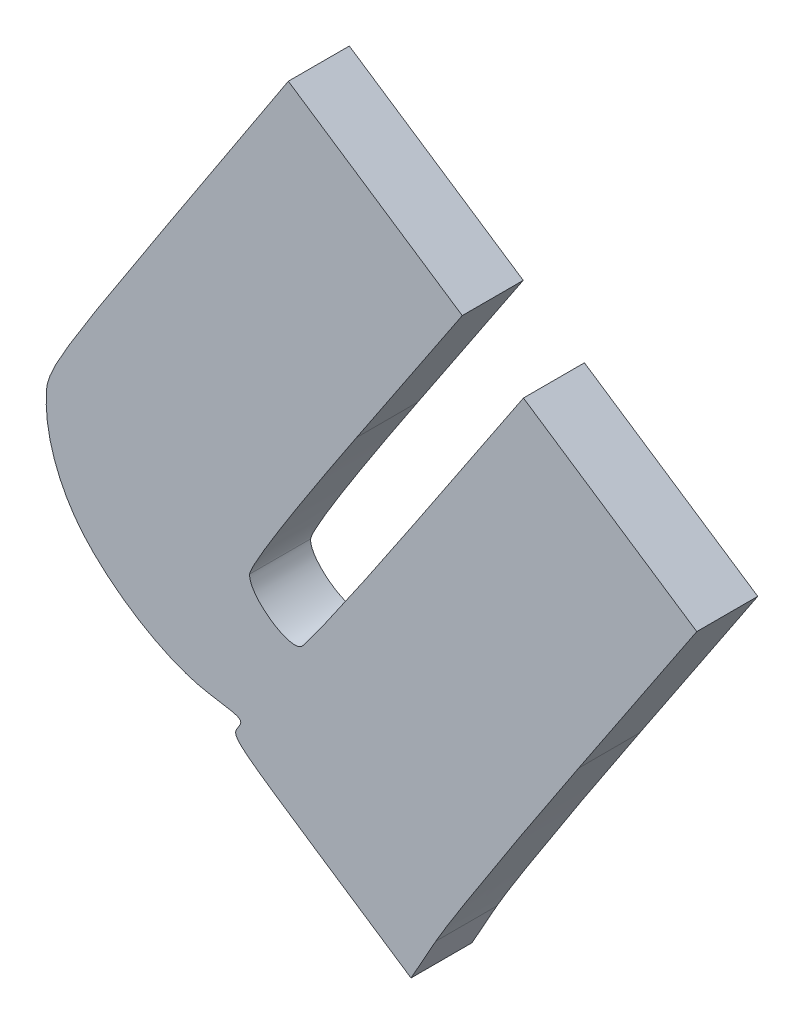
ISO-10303-21;
HEADER;
FILE_DESCRIPTION(('STEP AP214'),'2;1');
FILE_NAME('part.step','',(''),(''),'','','');
FILE_SCHEMA(('AUTOMOTIVE_DESIGN { 1 0 10303 214 1 1 1 1 }'));
ENDSEC;
DATA;
#1=APPLICATION_CONTEXT('core data for automotive mechanical design processes');
#2=APPLICATION_PROTOCOL_DEFINITION('international standard','automotive_design',2000,#1);
#3=PRODUCT_CONTEXT('',#1,'mechanical');
#4=PRODUCT('Part','Part','',(#3));
#5=PRODUCT_RELATED_PRODUCT_CATEGORY('part','',(#4));
#6=PRODUCT_DEFINITION_FORMATION('','',#4);
#7=PRODUCT_DEFINITION_CONTEXT('part definition',#1,'design');
#8=PRODUCT_DEFINITION('design','',#6,#7);
#9=PRODUCT_DEFINITION_SHAPE('','',#8);
#10=(LENGTH_UNIT() NAMED_UNIT(*) SI_UNIT(.MILLI.,.METRE.));
#11=(NAMED_UNIT(*) PLANE_ANGLE_UNIT() SI_UNIT($,.RADIAN.));
#12=(NAMED_UNIT(*) SI_UNIT($,.STERADIAN.) SOLID_ANGLE_UNIT());
#13=UNCERTAINTY_MEASURE_WITH_UNIT(LENGTH_MEASURE(1.E-05),#10,'distance_accuracy_value','');
#14=(GEOMETRIC_REPRESENTATION_CONTEXT(3) GLOBAL_UNCERTAINTY_ASSIGNED_CONTEXT((#13)) GLOBAL_UNIT_ASSIGNED_CONTEXT((#10,
#11,#12)) REPRESENTATION_CONTEXT('',''));
#15=CARTESIAN_POINT('',(0.,0.,0.));
#16=DIRECTION('',(0.,0.,1.));
#17=DIRECTION('',(1.,0.,0.));
#18=AXIS2_PLACEMENT_3D('',#15,#16,#17);
#19=CARTESIAN_POINT('',(-3.332705659981,-2.348591750992,0.));
#20=DIRECTION('',(-0.831947176556522,0.5548548417556,0.));
#21=DIRECTION('',(-0.5548548417556,-0.831947176556522,0.));
#22=AXIS2_PLACEMENT_3D('',#19,#20,#21);
#23=PLANE('',#22);
#24=DIRECTION('',(-0.5548548417556,-0.831947176556522,0.));
#25=VECTOR('',#24,1.);
#26=CARTESIAN_POINT('',(-3.332705659981,-2.348591750992,0.));
#27=LINE('',#26,#25);
#28=CARTESIAN_POINT('',(-3.332705659981,-2.348591750992,0.));
#29=VERTEX_POINT('',#28);
#30=CARTESIAN_POINT('',(-3.350218754394,-2.374850816163,0.));
#31=VERTEX_POINT('',#30);
#32=EDGE_CURVE('E11',#29,#31,#27,.T.);
#33=ORIENTED_EDGE('',*,*,#32,.T.);
#34=DIRECTION('',(0.,0.,1.));
#35=VECTOR('',#34,1.);
#36=CARTESIAN_POINT('',(-3.350218754394,-2.374850816163,0.));
#37=LINE('',#36,#35);
#38=CARTESIAN_POINT('',(-3.350218754394,-2.374850816163,0.01));
#39=VERTEX_POINT('',#38);
#40=EDGE_CURVE('E24',#31,#39,#37,.T.);
#41=ORIENTED_EDGE('',*,*,#40,.T.);
#42=DIRECTION('',(-0.5548548417556,-0.831947176556522,0.));
#43=VECTOR('',#42,1.);
#44=CARTESIAN_POINT('',(-3.332705659981,-2.348591750992,0.01));
#45=LINE('',#44,#43);
#46=CARTESIAN_POINT('',(-3.332705659981,-2.348591750992,0.01));
#47=VERTEX_POINT('',#46);
#48=EDGE_CURVE('E154',#47,#39,#45,.T.);
#49=ORIENTED_EDGE('',*,*,#48,.F.);
#50=DIRECTION('',(0.,0.,1.));
#51=VECTOR('',#50,1.);
#52=CARTESIAN_POINT('',(-3.332705659981,-2.348591750992,0.));
#53=LINE('',#52,#51);
#54=EDGE_CURVE('E349',#29,#47,#53,.T.);
#55=ORIENTED_EDGE('',*,*,#54,.F.);
#56=EDGE_LOOP('',(#33,#41,#49,#55));
#57=FACE_BOUND('',#56,.T.);
#58=ADVANCED_FACE('F17',(#57),#23,.T.);
#59=CARTESIAN_POINT('',(-3.304288751086,-2.367543987302,0.));
#60=DIRECTION('',(0.554854841755568,0.831947176556543,0.));
#61=DIRECTION('',(-0.831947176556543,0.554854841755568,0.));
#62=AXIS2_PLACEMENT_3D('',#59,#60,#61);
#63=PLANE('',#62);
#64=DIRECTION('',(-0.831947176556543,0.554854841755568,0.));
#65=VECTOR('',#64,1.);
#66=CARTESIAN_POINT('',(-3.304288751086,-2.367543987302,0.));
#67=LINE('',#66,#65);
#68=CARTESIAN_POINT('',(-3.304288751086,-2.367543987302,0.));
#69=VERTEX_POINT('',#68);
#70=EDGE_CURVE('E348',#69,#29,#67,.T.);
#71=ORIENTED_EDGE('',*,*,#70,.T.);
#72=ORIENTED_EDGE('',*,*,#54,.T.);
#73=DIRECTION('',(-0.831947176556543,0.554854841755568,0.));
#74=VECTOR('',#73,1.);
#75=CARTESIAN_POINT('',(-3.304288751086,-2.367543987302,0.01));
#76=LINE('',#75,#74);
#77=CARTESIAN_POINT('',(-3.304288751086,-2.367543987302,0.01));
#78=VERTEX_POINT('',#77);
#79=EDGE_CURVE('E353',#78,#47,#76,.T.);
#80=ORIENTED_EDGE('',*,*,#79,.F.);
#81=DIRECTION('',(0.,0.,1.));
#82=VECTOR('',#81,1.);
#83=CARTESIAN_POINT('',(-3.304288751086,-2.367543987302,0.));
#84=LINE('',#83,#82);
#85=EDGE_CURVE('E351',#69,#78,#84,.T.);
#86=ORIENTED_EDGE('',*,*,#85,.F.);
#87=EDGE_LOOP('',(#71,#72,#80,#86));
#88=FACE_BOUND('',#87,.T.);
#89=ADVANCED_FACE('F337',(#88),#63,.T.);
#90=CARTESIAN_POINT('',(-3.323645983482,-2.396596436384,0.));
#91=DIRECTION('',(0.832196577634114,-0.554480708567997,0.));
#92=DIRECTION('',(0.554480708567997,0.832196577634114,0.));
#93=AXIS2_PLACEMENT_3D('',#90,#91,#92);
#94=PLANE('',#93);
#95=DIRECTION('',(0.554480708567997,0.832196577634114,0.));
#96=VECTOR('',#95,1.);
#97=CARTESIAN_POINT('',(-3.323645983482,-2.396596436384,0.));
#98=LINE('',#97,#96);
#99=CARTESIAN_POINT('',(-3.323645983482,-2.396596436384,0.));
#100=VERTEX_POINT('',#99);
#101=EDGE_CURVE('E482',#100,#69,#98,.T.);
#102=ORIENTED_EDGE('',*,*,#101,.T.);
#103=ORIENTED_EDGE('',*,*,#85,.T.);
#104=DIRECTION('',(0.554480708567997,0.832196577634114,0.));
#105=VECTOR('',#104,1.);
#106=CARTESIAN_POINT('',(-3.323645983482,-2.396596436384,0.01));
#107=LINE('',#106,#105);
#108=CARTESIAN_POINT('',(-3.323645983482,-2.396596436384,0.01));
#109=VERTEX_POINT('',#108);
#110=EDGE_CURVE('E479',#109,#78,#107,.T.);
#111=ORIENTED_EDGE('',*,*,#110,.F.);
#112=DIRECTION('',(0.,0.,1.));
#113=VECTOR('',#112,1.);
#114=CARTESIAN_POINT('',(-3.323645983482,-2.396596436384,0.));
#115=LINE('',#114,#113);
#116=EDGE_CURVE('E473',#100,#109,#115,.T.);
#117=ORIENTED_EDGE('',*,*,#116,.F.);
#118=EDGE_LOOP('',(#102,#103,#111,#117));
#119=FACE_BOUND('',#118,.T.);
#120=ADVANCED_FACE('F329',(#119),#94,.T.);
#121=CARTESIAN_POINT('',(-3.347073290902,-2.432896745225,0.));
#122=CARTESIAN_POINT('',(-3.347073290902,-2.432896745225,0.01));
#123=CARTESIAN_POINT('',(-3.345444337573,-2.429988125205,0.));
#124=CARTESIAN_POINT('',(-3.345444337573,-2.429988125205,0.01));
#125=CARTESIAN_POINT('',(-3.339799899815,-2.421229037819,0.));
#126=CARTESIAN_POINT('',(-3.339799899815,-2.421229037819,0.01));
#127=CARTESIAN_POINT('',(-3.333863544286,-2.412029649405,0.));
#128=CARTESIAN_POINT('',(-3.333863544286,-2.412029649405,0.01));
#129=CARTESIAN_POINT('',(-3.328547125337,-2.403945189284,0.));
#130=CARTESIAN_POINT('',(-3.328547125337,-2.403945189284,0.01));
#131=CARTESIAN_POINT('',(-3.323645983482,-2.396596436384,0.));
#132=CARTESIAN_POINT('',(-3.323645983482,-2.396596436384,0.01));
#133=B_SPLINE_SURFACE_WITH_KNOTS('',3,1,((#121,#122),(#123,#124),(#125,#126),(#127,#128),(#129,
#130),(#131,#132)),.UNSPECIFIED.,.F.,.F.,.F.,(4,2,4),(2,2),(0.,0.001461185432297,
0.006761103341243),(0.,0.001),.UNSPECIFIED.);
#134=CARTESIAN_POINT('',(-3.347073290902,-2.432896745225,0.));
#135=CARTESIAN_POINT('',(-3.345444337573,-2.429988125205,0.));
#136=CARTESIAN_POINT('',(-3.339799899815,-2.421229037819,0.));
#137=CARTESIAN_POINT('',(-3.333863544286,-2.412029649405,0.));
#138=CARTESIAN_POINT('',(-3.328547125337,-2.403945189284,0.));
#139=CARTESIAN_POINT('',(-3.323645983482,-2.396596436384,0.));
#140=B_SPLINE_CURVE_WITH_KNOTS('',3,(#134,#135,#136,#137,#138,#139),.UNSPECIFIED.,.F.,.F.,(4,2,
4),(0.,0.001461185432297,0.006761103341243),.UNSPECIFIED.);
#141=CARTESIAN_POINT('',(-3.347073290902,-2.432896745225,0.));
#142=VERTEX_POINT('',#141);
#143=EDGE_CURVE('E465',#142,#100,#140,.T.);
#144=CARTESIAN_POINT('',(-3.347073290902,-2.432896745225,0.01));
#145=CARTESIAN_POINT('',(-3.345444337573,-2.429988125205,0.01));
#146=CARTESIAN_POINT('',(-3.339799899815,-2.421229037819,0.01));
#147=CARTESIAN_POINT('',(-3.333863544286,-2.412029649405,0.01));
#148=CARTESIAN_POINT('',(-3.328547125337,-2.403945189284,0.01));
#149=CARTESIAN_POINT('',(-3.323645983482,-2.396596436384,0.01));
#150=B_SPLINE_CURVE_WITH_KNOTS('',3,(#144,#145,#146,#147,#148,#149),.UNSPECIFIED.,.F.,.F.,(4,2,
4),(0.,0.001461185432297,0.006761103341243),.UNSPECIFIED.);
#151=CARTESIAN_POINT('',(-3.347073290902,-2.432896745225,0.01));
#152=VERTEX_POINT('',#151);
#153=EDGE_CURVE('E460',#152,#109,#150,.T.);
#154=DIRECTION('',(0.,0.,1.));
#155=VECTOR('',#154,1.);
#156=CARTESIAN_POINT('',(-3.347073290902,-2.432896745225,0.));
#157=LINE('',#156,#155);
#158=EDGE_CURVE('E457',#142,#152,#157,.T.);
#159=ORIENTED_EDGE('',*,*,#143,.T.);
#160=ORIENTED_EDGE('',*,*,#116,.T.);
#161=ORIENTED_EDGE('',*,*,#153,.F.);
#162=ORIENTED_EDGE('',*,*,#158,.F.);
#163=EDGE_LOOP('',(#159,#160,#161,#162));
#164=FACE_BOUND('',#163,.T.);
#165=ADVANCED_FACE('F323',(#164),#133,.T.);
#166=CARTESIAN_POINT('',(-3.351135260486,-2.44014999192,0.));
#167=DIRECTION('',(0.872498250070727,-0.488617236314398,0.));
#168=DIRECTION('',(0.488617236314398,0.872498250070727,0.));
#169=AXIS2_PLACEMENT_3D('',#166,#167,#168);
#170=PLANE('',#169);
#171=DIRECTION('',(0.488617236314398,0.872498250070727,0.));
#172=VECTOR('',#171,1.);
#173=CARTESIAN_POINT('',(-3.351135260486,-2.44014999192,0.));
#174=LINE('',#173,#172);
#175=CARTESIAN_POINT('',(-3.351135260486,-2.44014999192,0.));
#176=VERTEX_POINT('',#175);
#177=EDGE_CURVE('E454',#176,#142,#174,.T.);
#178=ORIENTED_EDGE('',*,*,#177,.T.);
#179=ORIENTED_EDGE('',*,*,#158,.T.);
#180=DIRECTION('',(0.488617236314398,0.872498250070727,0.));
#181=VECTOR('',#180,1.);
#182=CARTESIAN_POINT('',(-3.351135260486,-2.44014999192,0.01));
#183=LINE('',#182,#181);
#184=CARTESIAN_POINT('',(-3.351135260486,-2.44014999192,0.01));
#185=VERTEX_POINT('',#184);
#186=EDGE_CURVE('E451',#185,#152,#183,.T.);
#187=ORIENTED_EDGE('',*,*,#186,.F.);
#188=DIRECTION('',(0.,0.,1.));
#189=VECTOR('',#188,1.);
#190=CARTESIAN_POINT('',(-3.351135260486,-2.44014999192,0.));
#191=LINE('',#190,#189);
#192=EDGE_CURVE('E448',#176,#185,#191,.T.);
#193=ORIENTED_EDGE('',*,*,#192,.F.);
#194=EDGE_LOOP('',(#178,#179,#187,#193));
#195=FACE_BOUND('',#194,.T.);
#196=ADVANCED_FACE('F319',(#195),#170,.T.);
#197=CARTESIAN_POINT('',(-3.365885412259,-2.430312596761,0.));
#198=DIRECTION('',(-0.554854841755558,-0.83194717655655,0.));
#199=DIRECTION('',(0.83194717655655,-0.554854841755558,0.));
#200=AXIS2_PLACEMENT_3D('',#197,#198,#199);
#201=PLANE('',#200);
#202=DIRECTION('',(0.83194717655655,-0.554854841755558,0.));
#203=VECTOR('',#202,1.);
#204=CARTESIAN_POINT('',(-3.365885412259,-2.430312596761,0.));
#205=LINE('',#204,#203);
#206=CARTESIAN_POINT('',(-3.365885412259,-2.430312596761,0.));
#207=VERTEX_POINT('',#206);
#208=EDGE_CURVE('E445',#207,#176,#205,.T.);
#209=ORIENTED_EDGE('',*,*,#208,.T.);
#210=ORIENTED_EDGE('',*,*,#192,.T.);
#211=DIRECTION('',(0.83194717655655,-0.554854841755558,0.));
#212=VECTOR('',#211,1.);
#213=CARTESIAN_POINT('',(-3.365885412259,-2.430312596761,0.01));
#214=LINE('',#213,#212);
#215=CARTESIAN_POINT('',(-3.365885412259,-2.430312596761,0.01));
#216=VERTEX_POINT('',#215);
#217=EDGE_CURVE('E442',#216,#185,#214,.T.);
#218=ORIENTED_EDGE('',*,*,#217,.F.);
#219=DIRECTION('',(0.,0.,1.));
#220=VECTOR('',#219,1.);
#221=CARTESIAN_POINT('',(-3.365885412259,-2.430312596761,0.));
#222=LINE('',#221,#220);
#223=EDGE_CURVE('E436',#207,#216,#222,.T.);
#224=ORIENTED_EDGE('',*,*,#223,.F.);
#225=EDGE_LOOP('',(#209,#210,#218,#224));
#226=FACE_BOUND('',#225,.T.);
#227=ADVANCED_FACE('F310',(#226),#201,.T.);
#228=CARTESIAN_POINT('',(-3.379546498456,-2.418841978034,0.));
#229=CARTESIAN_POINT('',(-3.379546498456,-2.418841978034,0.01));
#230=CARTESIAN_POINT('',(-3.379624902086,-2.41895953613,0.));
#231=CARTESIAN_POINT('',(-3.379624902086,-2.41895953613,0.01));
#232=CARTESIAN_POINT('',(-3.379694728321,-2.41907244743,0.));
#233=CARTESIAN_POINT('',(-3.379694728321,-2.41907244743,0.01));
#234=CARTESIAN_POINT('',(-3.379801820828,-2.419290025889,0.));
#235=CARTESIAN_POINT('',(-3.379801820828,-2.419290025889,0.01));
#236=CARTESIAN_POINT('',(-3.379843580061,-2.419400665608,0.));
#237=CARTESIAN_POINT('',(-3.379843580061,-2.419400665608,0.01));
#238=CARTESIAN_POINT('',(-3.379885738625,-2.419640115929,0.));
#239=CARTESIAN_POINT('',(-3.379885738625,-2.419640115929,0.01));
#240=CARTESIAN_POINT('',(-3.379882046125,-2.419760017036,0.));
#241=CARTESIAN_POINT('',(-3.379882046125,-2.419760017036,0.01));
#242=CARTESIAN_POINT('',(-3.379820890905,-2.420030935849,0.));
#243=CARTESIAN_POINT('',(-3.379820890905,-2.420030935849,0.01));
#244=CARTESIAN_POINT('',(-3.379749295582,-2.420191187819,0.));
#245=CARTESIAN_POINT('',(-3.379749295582,-2.420191187819,0.01));
#246=CARTESIAN_POINT('',(-3.379405563823,-2.420708997672,0.));
#247=CARTESIAN_POINT('',(-3.379405563823,-2.420708997672,0.01));
#248=CARTESIAN_POINT('',(-3.379012380642,-2.421113997978,0.));
#249=CARTESIAN_POINT('',(-3.379012380642,-2.421113997978,0.01));
#250=CARTESIAN_POINT('',(-3.376598911792,-2.423140494786,0.));
#251=CARTESIAN_POINT('',(-3.376598911792,-2.423140494786,0.01));
#252=CARTESIAN_POINT('',(-3.372927520129,-2.425615967266,0.));
#253=CARTESIAN_POINT('',(-3.372927520129,-2.425615967266,0.01));
#254=CARTESIAN_POINT('',(-3.365885412259,-2.430312596761,0.));
#255=CARTESIAN_POINT('',(-3.365885412259,-2.430312596761,0.01));
#256=B_SPLINE_SURFACE_WITH_KNOTS('',3,1,((#228,#229),(#230,#231),(#232,#233),(#234,#235),(#236,
#237),(#238,#239),(#240,#241),(#242,#243),(#244,#245),(#246,#247),(#248,#249),(#250,#251),(#252,
#253),(#254,#255)),.UNSPECIFIED.,.F.,.F.,.F.,(4,2,2,2,2,2,4),(2,2),(0.,0.000768967608709977,
0.001493896604088,0.002259465008467,0.003201944413574,0.004987032742808,0.010065798367626),(0.,
0.001),.UNSPECIFIED.);
#257=CARTESIAN_POINT('',(-3.379546498456,-2.418841978034,0.));
#258=CARTESIAN_POINT('',(-3.379624902086,-2.41895953613,0.));
#259=CARTESIAN_POINT('',(-3.379694728321,-2.41907244743,0.));
#260=CARTESIAN_POINT('',(-3.379801820828,-2.419290025889,0.));
#261=CARTESIAN_POINT('',(-3.379843580061,-2.419400665608,0.));
#262=CARTESIAN_POINT('',(-3.379885738625,-2.419640115929,0.));
#263=CARTESIAN_POINT('',(-3.379882046125,-2.419760017036,0.));
#264=CARTESIAN_POINT('',(-3.379820890905,-2.420030935849,0.));
#265=CARTESIAN_POINT('',(-3.379749295582,-2.420191187819,0.));
#266=CARTESIAN_POINT('',(-3.379405563823,-2.420708997672,0.));
#267=CARTESIAN_POINT('',(-3.379012380642,-2.421113997978,0.));
#268=CARTESIAN_POINT('',(-3.376598911792,-2.423140494786,0.));
#269=CARTESIAN_POINT('',(-3.372927520129,-2.425615967266,0.));
#270=CARTESIAN_POINT('',(-3.365885412259,-2.430312596761,0.));
#271=B_SPLINE_CURVE_WITH_KNOTS('',3,(#257,#258,#259,#260,#261,#262,#263,#264,#265,#266,#267,
#268,#269,#270),.UNSPECIFIED.,.F.,.F.,(4,2,2,2,2,2,4),(0.,0.000768967608709977,
0.001493896604088,0.002259465008467,0.003201944413574,0.004987032742808,0.010065798367626),.UNSPECIFIED.);
#272=CARTESIAN_POINT('',(-3.379546498456,-2.418841978034,0.));
#273=VERTEX_POINT('',#272);
#274=EDGE_CURVE('E428',#273,#207,#271,.T.);
#275=CARTESIAN_POINT('',(-3.379546498456,-2.418841978034,0.01));
#276=CARTESIAN_POINT('',(-3.379624902086,-2.41895953613,0.01));
#277=CARTESIAN_POINT('',(-3.379694728321,-2.41907244743,0.01));
#278=CARTESIAN_POINT('',(-3.379801820828,-2.419290025889,0.01));
#279=CARTESIAN_POINT('',(-3.379843580061,-2.419400665608,0.01));
#280=CARTESIAN_POINT('',(-3.379885738625,-2.419640115929,0.01));
#281=CARTESIAN_POINT('',(-3.379882046125,-2.419760017036,0.01));
#282=CARTESIAN_POINT('',(-3.379820890905,-2.420030935849,0.01));
#283=CARTESIAN_POINT('',(-3.379749295582,-2.420191187819,0.01));
#284=CARTESIAN_POINT('',(-3.379405563823,-2.420708997672,0.01));
#285=CARTESIAN_POINT('',(-3.379012380642,-2.421113997978,0.01));
#286=CARTESIAN_POINT('',(-3.376598911792,-2.423140494786,0.01));
#287=CARTESIAN_POINT('',(-3.372927520129,-2.425615967266,0.01));
#288=CARTESIAN_POINT('',(-3.365885412259,-2.430312596761,0.01));
#289=B_SPLINE_CURVE_WITH_KNOTS('',3,(#275,#276,#277,#278,#279,#280,#281,#282,#283,#284,#285,
#286,#287,#288),.UNSPECIFIED.,.F.,.F.,(4,2,2,2,2,2,4),(0.,0.000768967608709977,
0.001493896604088,0.002259465008467,0.003201944413574,0.004987032742808,0.010065798367626),.UNSPECIFIED.);
#290=CARTESIAN_POINT('',(-3.379546498456,-2.418841978034,0.01));
#291=VERTEX_POINT('',#290);
#292=EDGE_CURVE('E423',#291,#216,#289,.T.);
#293=DIRECTION('',(0.,0.,1.));
#294=VECTOR('',#293,1.);
#295=CARTESIAN_POINT('',(-3.379546498456,-2.418841978034,0.));
#296=LINE('',#295,#294);
#297=EDGE_CURVE('E417',#273,#291,#296,.T.);
#298=ORIENTED_EDGE('',*,*,#274,.T.);
#299=ORIENTED_EDGE('',*,*,#223,.T.);
#300=ORIENTED_EDGE('',*,*,#292,.F.);
#301=ORIENTED_EDGE('',*,*,#297,.F.);
#302=EDGE_LOOP('',(#298,#299,#300,#301));
#303=FACE_BOUND('',#302,.T.);
#304=ADVANCED_FACE('F299',(#303),#256,.T.);
#305=CARTESIAN_POINT('',(-3.38420767803,-2.416325276533,0.));
#306=CARTESIAN_POINT('',(-3.38420767803,-2.416325276533,0.01));
#307=CARTESIAN_POINT('',(-3.3828762608,-2.416529857808,0.));
#308=CARTESIAN_POINT('',(-3.3828762608,-2.416529857808,0.01));
#309=CARTESIAN_POINT('',(-3.3816793414,-2.416717371918,0.));
#310=CARTESIAN_POINT('',(-3.3816793414,-2.416717371918,0.01));
#311=CARTESIAN_POINT('',(-3.380279176911,-2.417003023203,0.));
#312=CARTESIAN_POINT('',(-3.380279176911,-2.417003023203,0.01));
#313=CARTESIAN_POINT('',(-3.379860346039,-2.41711537522,0.));
#314=CARTESIAN_POINT('',(-3.379860346039,-2.41711537522,0.01));
#315=CARTESIAN_POINT('',(-3.379433890341,-2.417297164595,0.));
#316=CARTESIAN_POINT('',(-3.379433890341,-2.417297164595,0.01));
#317=CARTESIAN_POINT('',(-3.379325575501,-2.41735859457,0.));
#318=CARTESIAN_POINT('',(-3.379325575501,-2.41735859457,0.01));
#319=CARTESIAN_POINT('',(-3.379192959382,-2.417466090865,0.));
#320=CARTESIAN_POINT('',(-3.379192959382,-2.417466090865,0.01));
#321=CARTESIAN_POINT('',(-3.379146717426,-2.417513826588,0.));
#322=CARTESIAN_POINT('',(-3.379146717426,-2.417513826588,0.01));
#323=CARTESIAN_POINT('',(-3.379081891921,-2.417618185083,0.));
#324=CARTESIAN_POINT('',(-3.379081891921,-2.417618185083,0.01));
#325=CARTESIAN_POINT('',(-3.379062119028,-2.417670258863,0.));
#326=CARTESIAN_POINT('',(-3.379062119028,-2.417670258863,0.01));
#327=CARTESIAN_POINT('',(-3.379041906829,-2.417795785466,0.));
#328=CARTESIAN_POINT('',(-3.379041906829,-2.417795785466,0.01));
#329=CARTESIAN_POINT('',(-3.379047646557,-2.417865872299,0.));
#330=CARTESIAN_POINT('',(-3.379047646557,-2.417865872299,0.01));
#331=CARTESIAN_POINT('',(-3.379114351654,-2.418172159397,0.));
#332=CARTESIAN_POINT('',(-3.379114351654,-2.418172159397,0.01));
#333=CARTESIAN_POINT('',(-3.379294774169,-2.418464543624,0.));
#334=CARTESIAN_POINT('',(-3.379294774169,-2.418464543624,0.01));
#335=CARTESIAN_POINT('',(-3.379546498456,-2.418841978034,0.));
#336=CARTESIAN_POINT('',(-3.379546498456,-2.418841978034,0.01));
#337=B_SPLINE_SURFACE_WITH_KNOTS('',3,1,((#305,#306),(#307,#308),(#309,#310),(#311,#312),(#313,
#314),(#315,#316),(#317,#318),(#319,#320),(#321,#322),(#323,#324),(#325,#326),(#327,#328),(#329,
#330),(#331,#332),(#333,#334),(#335,#336)),.UNSPECIFIED.,.F.,.F.,.F.,(4,2,2,2,2,2,2,4),(2,2),
(0.,0.00034413270238388,0.000588097697252863,0.000705602347069612,0.000778646167997065,
0.000842349803803281,0.000920098183708306,0.001192303742564),(0.,0.001),.UNSPECIFIED.);
#338=CARTESIAN_POINT('',(-3.38420767803,-2.416325276533,0.));
#339=CARTESIAN_POINT('',(-3.3828762608,-2.416529857808,0.));
#340=CARTESIAN_POINT('',(-3.3816793414,-2.416717371918,0.));
#341=CARTESIAN_POINT('',(-3.380279176911,-2.417003023203,0.));
#342=CARTESIAN_POINT('',(-3.379860346039,-2.41711537522,0.));
#343=CARTESIAN_POINT('',(-3.379433890341,-2.417297164595,0.));
#344=CARTESIAN_POINT('',(-3.379325575501,-2.41735859457,0.));
#345=CARTESIAN_POINT('',(-3.379192959382,-2.417466090865,0.));
#346=CARTESIAN_POINT('',(-3.379146717426,-2.417513826588,0.));
#347=CARTESIAN_POINT('',(-3.379081891921,-2.417618185083,0.));
#348=CARTESIAN_POINT('',(-3.379062119028,-2.417670258863,0.));
#349=CARTESIAN_POINT('',(-3.379041906829,-2.417795785466,0.));
#350=CARTESIAN_POINT('',(-3.379047646557,-2.417865872299,0.));
#351=CARTESIAN_POINT('',(-3.379114351654,-2.418172159397,0.));
#352=CARTESIAN_POINT('',(-3.379294774169,-2.418464543624,0.));
#353=CARTESIAN_POINT('',(-3.379546498456,-2.418841978034,0.));
#354=B_SPLINE_CURVE_WITH_KNOTS('',3,(#338,#339,#340,#341,#342,#343,#344,#345,#346,#347,#348,
#349,#350,#351,#352,#353),.UNSPECIFIED.,.F.,.F.,(4,2,2,2,2,2,2,4),(0.,0.00034413270238388,
0.000588097697252863,0.000705602347069612,0.000778646167997065,0.000842349803803281,
0.000920098183708306,0.001192303742564),.UNSPECIFIED.);
#355=CARTESIAN_POINT('',(-3.38420767803,-2.416325276533,0.));
#356=VERTEX_POINT('',#355);
#357=EDGE_CURVE('E409',#356,#273,#354,.T.);
#358=CARTESIAN_POINT('',(-3.38420767803,-2.416325276533,0.01));
#359=CARTESIAN_POINT('',(-3.3828762608,-2.416529857808,0.01));
#360=CARTESIAN_POINT('',(-3.3816793414,-2.416717371918,0.01));
#361=CARTESIAN_POINT('',(-3.380279176911,-2.417003023203,0.01));
#362=CARTESIAN_POINT('',(-3.379860346039,-2.41711537522,0.01));
#363=CARTESIAN_POINT('',(-3.379433890341,-2.417297164595,0.01));
#364=CARTESIAN_POINT('',(-3.379325575501,-2.41735859457,0.01));
#365=CARTESIAN_POINT('',(-3.379192959382,-2.417466090865,0.01));
#366=CARTESIAN_POINT('',(-3.379146717426,-2.417513826588,0.01));
#367=CARTESIAN_POINT('',(-3.379081891921,-2.417618185083,0.01));
#368=CARTESIAN_POINT('',(-3.379062119028,-2.417670258863,0.01));
#369=CARTESIAN_POINT('',(-3.379041906829,-2.417795785466,0.01));
#370=CARTESIAN_POINT('',(-3.379047646557,-2.417865872299,0.01));
#371=CARTESIAN_POINT('',(-3.379114351654,-2.418172159397,0.01));
#372=CARTESIAN_POINT('',(-3.379294774169,-2.418464543624,0.01));
#373=CARTESIAN_POINT('',(-3.379546498456,-2.418841978034,0.01));
#374=B_SPLINE_CURVE_WITH_KNOTS('',3,(#358,#359,#360,#361,#362,#363,#364,#365,#366,#367,#368,
#369,#370,#371,#372,#373),.UNSPECIFIED.,.F.,.F.,(4,2,2,2,2,2,2,4),(0.,0.00034413270238388,
0.000588097697252863,0.000705602347069612,0.000778646167997065,0.000842349803803281,
0.000920098183708306,0.001192303742564),.UNSPECIFIED.);
#375=CARTESIAN_POINT('',(-3.38420767803,-2.416325276533,0.01));
#376=VERTEX_POINT('',#375);
#377=EDGE_CURVE('E404',#376,#291,#374,.T.);
#378=DIRECTION('',(0.,0.,1.));
#379=VECTOR('',#378,1.);
#380=CARTESIAN_POINT('',(-3.38420767803,-2.416325276533,0.));
#381=LINE('',#380,#379);
#382=EDGE_CURVE('E401',#356,#376,#381,.T.);
#383=ORIENTED_EDGE('',*,*,#357,.T.);
#384=ORIENTED_EDGE('',*,*,#297,.T.);
#385=ORIENTED_EDGE('',*,*,#377,.F.);
#386=ORIENTED_EDGE('',*,*,#382,.F.);
#387=EDGE_LOOP('',(#383,#384,#385,#386));
#388=FACE_BOUND('',#387,.T.);
#389=ADVANCED_FACE('F284',(#388),#337,.T.);
#390=CARTESIAN_POINT('',(-3.406322203296,-2.402124890551,0.));
#391=CARTESIAN_POINT('',(-3.406322203296,-2.402124890551,0.01));
#392=CARTESIAN_POINT('',(-3.404711758181,-2.404427493198,0.));
#393=CARTESIAN_POINT('',(-3.404711758181,-2.404427493198,0.01));
#394=CARTESIAN_POINT('',(-3.402432255578,-2.406716493274,0.));
#395=CARTESIAN_POINT('',(-3.402432255578,-2.406716493274,0.01));
#396=CARTESIAN_POINT('',(-3.397269351672,-2.410788869601,0.));
#397=CARTESIAN_POINT('',(-3.397269351672,-2.410788869601,0.01));
#398=CARTESIAN_POINT('',(-3.394352740169,-2.412613908735,0.));
#399=CARTESIAN_POINT('',(-3.394352740169,-2.412613908735,0.01));
#400=CARTESIAN_POINT('',(-3.388910693272,-2.415158756643,0.));
#401=CARTESIAN_POINT('',(-3.388910693272,-2.415158756643,0.01));
#402=CARTESIAN_POINT('',(-3.386438290455,-2.415982529726,0.));
#403=CARTESIAN_POINT('',(-3.386438290455,-2.415982529726,0.01));
#404=CARTESIAN_POINT('',(-3.38420767803,-2.416325276533,0.));
#405=CARTESIAN_POINT('',(-3.38420767803,-2.416325276533,0.01));
#406=B_SPLINE_SURFACE_WITH_KNOTS('',3,1,((#390,#391),(#392,#393),(#394,#395),(#396,#397),(#398,
#399),(#400,#401),(#402,#403),(#404,#405)),.UNSPECIFIED.,.F.,.F.,.F.,(4,2,2,4),(2,2),(0.,
0.001623401155154,0.00322098322242,0.004575058028067),(0.,0.001),.UNSPECIFIED.);
#407=CARTESIAN_POINT('',(-3.406322203296,-2.402124890551,0.));
#408=CARTESIAN_POINT('',(-3.404711758181,-2.404427493198,0.));
#409=CARTESIAN_POINT('',(-3.402432255578,-2.406716493274,0.));
#410=CARTESIAN_POINT('',(-3.397269351672,-2.410788869601,0.));
#411=CARTESIAN_POINT('',(-3.394352740169,-2.412613908735,0.));
#412=CARTESIAN_POINT('',(-3.388910693272,-2.415158756643,0.));
#413=CARTESIAN_POINT('',(-3.386438290455,-2.415982529726,0.));
#414=CARTESIAN_POINT('',(-3.38420767803,-2.416325276533,0.));
#415=B_SPLINE_CURVE_WITH_KNOTS('',3,(#407,#408,#409,#410,#411,#412,#413,#414),.UNSPECIFIED.,.F.,
.F.,(4,2,2,4),(0.,0.001623401155154,0.00322098322242,0.004575058028067),.UNSPECIFIED.);
#416=CARTESIAN_POINT('',(-3.406330526529,-2.402120113083,0.));
#417=VERTEX_POINT('',#416);
#418=EDGE_CURVE('E392',#417,#356,#415,.T.);
#419=CARTESIAN_POINT('',(-3.406322203296,-2.402124890551,0.01));
#420=CARTESIAN_POINT('',(-3.404711758181,-2.404427493198,0.01));
#421=CARTESIAN_POINT('',(-3.402432255578,-2.406716493274,0.01));
#422=CARTESIAN_POINT('',(-3.397269351672,-2.410788869601,0.01));
#423=CARTESIAN_POINT('',(-3.394352740169,-2.412613908735,0.01));
#424=CARTESIAN_POINT('',(-3.388910693272,-2.415158756643,0.01));
#425=CARTESIAN_POINT('',(-3.386438290455,-2.415982529726,0.01));
#426=CARTESIAN_POINT('',(-3.38420767803,-2.416325276533,0.01));
#427=B_SPLINE_CURVE_WITH_KNOTS('',3,(#419,#420,#421,#422,#423,#424,#425,#426),.UNSPECIFIED.,.F.,
.F.,(4,2,2,4),(0.,0.001623401155154,0.00322098322242,0.004575058028067),.UNSPECIFIED.);
#428=CARTESIAN_POINT('',(-3.406330526529,-2.402120113083,0.01));
#429=VERTEX_POINT('',#428);
#430=EDGE_CURVE('E380',#429,#376,#427,.T.);
#431=CARTESIAN_POINT('',(-3.406330526529,-2.402120113083,0.));
#432=CARTESIAN_POINT('',(-3.406330526529,-2.402120113083,0.01));
#433=B_SPLINE_CURVE_WITH_KNOTS('',1,(#431,#432),.UNSPECIFIED.,.F.,.F.,(2,2),(0.,0.001),.UNSPECIFIED.);
#434=EDGE_CURVE('E264',#417,#429,#433,.T.);
#435=ORIENTED_EDGE('',*,*,#418,.T.);
#436=ORIENTED_EDGE('',*,*,#382,.T.);
#437=ORIENTED_EDGE('',*,*,#430,.F.);
#438=ORIENTED_EDGE('',*,*,#434,.F.);
#439=EDGE_LOOP('',(#435,#436,#437,#438));
#440=FACE_BOUND('',#439,.T.);
#441=ADVANCED_FACE('F271',(#440),#406,.T.);
#442=CARTESIAN_POINT('',(-3.410874276911,-2.386421847419,0.));
#443=CARTESIAN_POINT('',(-3.410874276911,-2.386421847419,0.01));
#444=CARTESIAN_POINT('',(-3.411097455526,-2.389117585289,0.));
#445=CARTESIAN_POINT('',(-3.411097455526,-2.389117585289,0.01));
#446=CARTESIAN_POINT('',(-3.410773009769,-2.39184893435,0.));
#447=CARTESIAN_POINT('',(-3.410773009769,-2.39184893435,0.01));
#448=CARTESIAN_POINT('',(-3.409228525708,-2.397184998363,0.));
#449=CARTESIAN_POINT('',(-3.409228525708,-2.397184998363,0.01));
#450=CARTESIAN_POINT('',(-3.407964110101,-2.399784392112,0.));
#451=CARTESIAN_POINT('',(-3.407964110101,-2.399784392112,0.01));
#452=CARTESIAN_POINT('',(-3.406330526529,-2.402120113083,0.));
#453=CARTESIAN_POINT('',(-3.406330526529,-2.402120113083,0.01));
#454=B_SPLINE_SURFACE_WITH_KNOTS('',3,1,((#442,#443),(#444,#445),(#446,#447),(#448,#449),(#450,
#451),(#452,#453)),.UNSPECIFIED.,.F.,.F.,.F.,(4,2,4),(2,2),(0.,0.001629590262197,
0.003339767909847),(0.,0.001),.UNSPECIFIED.);
#455=CARTESIAN_POINT('',(-3.410874276911,-2.386421847419,0.));
#456=CARTESIAN_POINT('',(-3.411097455526,-2.389117585289,0.));
#457=CARTESIAN_POINT('',(-3.410773009769,-2.39184893435,0.));
#458=CARTESIAN_POINT('',(-3.409228525708,-2.397184998363,0.));
#459=CARTESIAN_POINT('',(-3.407964110101,-2.399784392112,0.));
#460=CARTESIAN_POINT('',(-3.406330526529,-2.402120113083,0.));
#461=B_SPLINE_CURVE_WITH_KNOTS('',3,(#455,#456,#457,#458,#459,#460),.UNSPECIFIED.,.F.,.F.,(4,2,
4),(0.,0.001629590262197,0.003339767909847),.UNSPECIFIED.);
#462=CARTESIAN_POINT('',(-3.410874276911,-2.386421847419,0.));
#463=VERTEX_POINT('',#462);
#464=EDGE_CURVE('E254',#463,#417,#461,.T.);
#465=CARTESIAN_POINT('',(-3.410874276911,-2.386421847419,0.01));
#466=CARTESIAN_POINT('',(-3.411097455526,-2.389117585289,0.01));
#467=CARTESIAN_POINT('',(-3.410773009769,-2.39184893435,0.01));
#468=CARTESIAN_POINT('',(-3.409228525708,-2.397184998363,0.01));
#469=CARTESIAN_POINT('',(-3.407964110101,-2.399784392112,0.01));
#470=CARTESIAN_POINT('',(-3.406330526529,-2.402120113083,0.01));
#471=B_SPLINE_CURVE_WITH_KNOTS('',3,(#465,#466,#467,#468,#469,#470),.UNSPECIFIED.,.F.,.F.,(4,2,
4),(0.,0.001629590262197,0.003339767909847),.UNSPECIFIED.);
#472=CARTESIAN_POINT('',(-3.410874276911,-2.386421847419,0.01));
#473=VERTEX_POINT('',#472);
#474=EDGE_CURVE('E244',#473,#429,#471,.T.);
#475=DIRECTION('',(0.,0.,1.));
#476=VECTOR('',#475,1.);
#477=CARTESIAN_POINT('',(-3.410874276911,-2.386421847419,0.));
#478=LINE('',#477,#476);
#479=EDGE_CURVE('E238',#463,#473,#478,.T.);
#480=ORIENTED_EDGE('',*,*,#464,.T.);
#481=ORIENTED_EDGE('',*,*,#434,.T.);
#482=ORIENTED_EDGE('',*,*,#474,.F.);
#483=ORIENTED_EDGE('',*,*,#479,.F.);
#484=EDGE_LOOP('',(#480,#481,#482,#483));
#485=FACE_BOUND('',#484,.T.);
#486=ADVANCED_FACE('F283',(#485),#454,.T.);
#487=CARTESIAN_POINT('',(-3.390919504913,-2.352937685292,0.));
#488=CARTESIAN_POINT('',(-3.390919504913,-2.352937685292,0.01));
#489=CARTESIAN_POINT('',(-3.40357441214,-2.372271017224,0.));
#490=CARTESIAN_POINT('',(-3.40357441214,-2.372271017224,0.01));
#491=CARTESIAN_POINT('',(-3.408293687956,-2.379696232637,0.));
#492=CARTESIAN_POINT('',(-3.408293687956,-2.379696232637,0.01));
#493=CARTESIAN_POINT('',(-3.410586442472,-2.384778502708,0.));
#494=CARTESIAN_POINT('',(-3.410586442472,-2.384778502708,0.01));
#495=CARTESIAN_POINT('',(-3.410810171237,-2.385647590028,0.));
#496=CARTESIAN_POINT('',(-3.410810171237,-2.385647590028,0.01));
#497=CARTESIAN_POINT('',(-3.410874276911,-2.386421847419,0.));
#498=CARTESIAN_POINT('',(-3.410874276911,-2.386421847419,0.01));
#499=B_SPLINE_SURFACE_WITH_KNOTS('',3,1,((#487,#488),(#489,#490),(#491,#492),(#493,#494),(#495,
#496),(#497,#498)),.UNSPECIFIED.,.F.,.F.,.F.,(4,2,4),(2,2),(0.,0.001329577323115,
0.001795721352547),(0.,0.001),.UNSPECIFIED.);
#500=CARTESIAN_POINT('',(-3.390919504913,-2.352937685292,0.));
#501=CARTESIAN_POINT('',(-3.40357441214,-2.372271017224,0.));
#502=CARTESIAN_POINT('',(-3.408293687956,-2.379696232637,0.));
#503=CARTESIAN_POINT('',(-3.410586442472,-2.384778502708,0.));
#504=CARTESIAN_POINT('',(-3.410810171237,-2.385647590028,0.));
#505=CARTESIAN_POINT('',(-3.410874276911,-2.386421847419,0.));
#506=B_SPLINE_CURVE_WITH_KNOTS('',3,(#500,#501,#502,#503,#504,#505),.UNSPECIFIED.,.F.,.F.,(4,2,
4),(0.,0.001329577323115,0.001795721352547),.UNSPECIFIED.);
#507=CARTESIAN_POINT('',(-3.390919504913,-2.352937685292,0.));
#508=VERTEX_POINT('',#507);
#509=EDGE_CURVE('E230',#508,#463,#506,.T.);
#510=CARTESIAN_POINT('',(-3.390919504913,-2.352937685292,0.01));
#511=CARTESIAN_POINT('',(-3.40357441214,-2.372271017224,0.01));
#512=CARTESIAN_POINT('',(-3.408293687956,-2.379696232637,0.01));
#513=CARTESIAN_POINT('',(-3.410586442472,-2.384778502708,0.01));
#514=CARTESIAN_POINT('',(-3.410810171237,-2.385647590028,0.01));
#515=CARTESIAN_POINT('',(-3.410874276911,-2.386421847419,0.01));
#516=B_SPLINE_CURVE_WITH_KNOTS('',3,(#510,#511,#512,#513,#514,#515),.UNSPECIFIED.,.F.,.F.,(4,2,
4),(0.,0.001329577323115,0.001795721352547),.UNSPECIFIED.);
#517=CARTESIAN_POINT('',(-3.390919504913,-2.352937685292,0.01));
#518=VERTEX_POINT('',#517);
#519=EDGE_CURVE('E225',#518,#473,#516,.T.);
#520=DIRECTION('',(0.,0.,1.));
#521=VECTOR('',#520,1.);
#522=CARTESIAN_POINT('',(-3.390919504913,-2.352937685292,0.));
#523=LINE('',#522,#521);
#524=EDGE_CURVE('E222',#508,#518,#523,.T.);
#525=ORIENTED_EDGE('',*,*,#509,.T.);
#526=ORIENTED_EDGE('',*,*,#479,.T.);
#527=ORIENTED_EDGE('',*,*,#519,.F.);
#528=ORIENTED_EDGE('',*,*,#524,.F.);
#529=EDGE_LOOP('',(#525,#526,#527,#528));
#530=FACE_BOUND('',#529,.T.);
#531=ADVANCED_FACE('F374',(#530),#499,.T.);
#532=CARTESIAN_POINT('',(-3.371248573924,-2.322886125659,0.));
#533=DIRECTION('',(-0.836691065099124,0.547675142382136,0.));
#534=DIRECTION('',(-0.547675142382136,-0.836691065099124,0.));
#535=AXIS2_PLACEMENT_3D('',#532,#533,#534);
#536=PLANE('',#535);
#537=DIRECTION('',(-0.547675142382136,-0.836691065099124,0.));
#538=VECTOR('',#537,1.);
#539=CARTESIAN_POINT('',(-3.371248573924,-2.322886125659,0.));
#540=LINE('',#539,#538);
#541=CARTESIAN_POINT('',(-3.371248573924,-2.322886125659,0.));
#542=VERTEX_POINT('',#541);
#543=EDGE_CURVE('E219',#542,#508,#540,.T.);
#544=ORIENTED_EDGE('',*,*,#543,.T.);
#545=ORIENTED_EDGE('',*,*,#524,.T.);
#546=DIRECTION('',(-0.547675142382136,-0.836691065099124,0.));
#547=VECTOR('',#546,1.);
#548=CARTESIAN_POINT('',(-3.371248573924,-2.322886125659,0.01));
#549=LINE('',#548,#547);
#550=CARTESIAN_POINT('',(-3.371248573924,-2.322886125659,0.01));
#551=VERTEX_POINT('',#550);
#552=EDGE_CURVE('E216',#551,#518,#549,.T.);
#553=ORIENTED_EDGE('',*,*,#552,.F.);
#554=DIRECTION('',(0.,0.,1.));
#555=VECTOR('',#554,1.);
#556=CARTESIAN_POINT('',(-3.371248573924,-2.322886125659,0.));
#557=LINE('',#556,#555);
#558=EDGE_CURVE('E213',#542,#551,#557,.T.);
#559=ORIENTED_EDGE('',*,*,#558,.F.);
#560=EDGE_LOOP('',(#544,#545,#553,#559));
#561=FACE_BOUND('',#560,.T.);
#562=ADVANCED_FACE('F370',(#561),#536,.T.);
#563=CARTESIAN_POINT('',(-3.342735157237,-2.341902726412,0.));
#564=DIRECTION('',(0.554854841755605,0.831947176556518,0.));
#565=DIRECTION('',(-0.831947176556518,0.554854841755605,0.));
#566=AXIS2_PLACEMENT_3D('',#563,#564,#565);
#567=PLANE('',#566);
#568=DIRECTION('',(-0.831947176556518,0.554854841755605,0.));
#569=VECTOR('',#568,1.);
#570=CARTESIAN_POINT('',(-3.342735157237,-2.341902726412,0.));
#571=LINE('',#570,#569);
#572=CARTESIAN_POINT('',(-3.342735157237,-2.341902726412,0.));
#573=VERTEX_POINT('',#572);
#574=EDGE_CURVE('E210',#573,#542,#571,.T.);
#575=ORIENTED_EDGE('',*,*,#574,.T.);
#576=ORIENTED_EDGE('',*,*,#558,.T.);
#577=DIRECTION('',(-0.831947176556518,0.554854841755605,0.));
#578=VECTOR('',#577,1.);
#579=CARTESIAN_POINT('',(-3.342735157237,-2.341902726412,0.01));
#580=LINE('',#579,#578);
#581=CARTESIAN_POINT('',(-3.342735157237,-2.341902726412,0.01));
#582=VERTEX_POINT('',#581);
#583=EDGE_CURVE('E207',#582,#551,#580,.T.);
#584=ORIENTED_EDGE('',*,*,#583,.F.);
#585=DIRECTION('',(0.,0.,1.));
#586=VECTOR('',#585,1.);
#587=CARTESIAN_POINT('',(-3.342735157237,-2.341902726412,0.));
#588=LINE('',#587,#586);
#589=EDGE_CURVE('E204',#573,#582,#588,.T.);
#590=ORIENTED_EDGE('',*,*,#589,.F.);
#591=EDGE_LOOP('',(#575,#576,#584,#590));
#592=FACE_BOUND('',#591,.T.);
#593=ADVANCED_FACE('F367',(#592),#567,.T.);
#594=CARTESIAN_POINT('',(-3.360051778974,-2.36786720122,0.));
#595=DIRECTION('',(0.831947176556569,-0.55485484175553,0.));
#596=DIRECTION('',(0.55485484175553,0.831947176556569,0.));
#597=AXIS2_PLACEMENT_3D('',#594,#595,#596);
#598=PLANE('',#597);
#599=DIRECTION('',(0.55485484175553,0.831947176556568,0.));
#600=VECTOR('',#599,1.);
#601=CARTESIAN_POINT('',(-3.360051778974,-2.36786720122,0.));
#602=LINE('',#601,#600);
#603=CARTESIAN_POINT('',(-3.360051778974,-2.36786720122,0.));
#604=VERTEX_POINT('',#603);
#605=EDGE_CURVE('E201',#604,#573,#602,.T.);
#606=ORIENTED_EDGE('',*,*,#605,.T.);
#607=ORIENTED_EDGE('',*,*,#589,.T.);
#608=DIRECTION('',(0.55485484175553,0.831947176556568,0.));
#609=VECTOR('',#608,1.);
#610=CARTESIAN_POINT('',(-3.360051778974,-2.36786720122,0.01));
#611=LINE('',#610,#609);
#612=CARTESIAN_POINT('',(-3.360051778974,-2.36786720122,0.01));
#613=VERTEX_POINT('',#612);
#614=EDGE_CURVE('E198',#613,#582,#611,.T.);
#615=ORIENTED_EDGE('',*,*,#614,.F.);
#616=DIRECTION('',(0.,0.,1.));
#617=VECTOR('',#616,1.);
#618=CARTESIAN_POINT('',(-3.360051778974,-2.36786720122,0.));
#619=LINE('',#618,#617);
#620=EDGE_CURVE('E192',#604,#613,#619,.T.);
#621=ORIENTED_EDGE('',*,*,#620,.F.);
#622=EDGE_LOOP('',(#606,#607,#615,#621));
#623=FACE_BOUND('',#622,.T.);
#624=ADVANCED_FACE('F364',(#623),#598,.T.);
#625=CARTESIAN_POINT('',(-3.377581421838,-2.396025334143,0.));
#626=CARTESIAN_POINT('',(-3.377581421838,-2.396025334143,0.01));
#627=CARTESIAN_POINT('',(-3.377562297057,-2.395828379465,0.));
#628=CARTESIAN_POINT('',(-3.377562297057,-2.395828379465,0.01));
#629=CARTESIAN_POINT('',(-3.37741500641,-2.395468614902,0.));
#630=CARTESIAN_POINT('',(-3.37741500641,-2.395468614902,0.01));
#631=CARTESIAN_POINT('',(-3.376975166954,-2.394536499429,0.));
#632=CARTESIAN_POINT('',(-3.376975166954,-2.394536499429,0.01));
#633=CARTESIAN_POINT('',(-3.376609572585,-2.393863963713,0.));
#634=CARTESIAN_POINT('',(-3.376609572585,-2.393863963713,0.01));
#635=CARTESIAN_POINT('',(-3.375317477399,-2.391553908544,0.));
#636=CARTESIAN_POINT('',(-3.375317477399,-2.391553908544,0.01));
#637=CARTESIAN_POINT('',(-3.373914699045,-2.389263692391,0.));
#638=CARTESIAN_POINT('',(-3.373914699045,-2.389263692391,0.01));
#639=CARTESIAN_POINT('',(-3.36909741095,-2.381525611378,0.));
#640=CARTESIAN_POINT('',(-3.36909741095,-2.381525611378,0.01));
#641=CARTESIAN_POINT('',(-3.364072234222,-2.373895456073,0.));
#642=CARTESIAN_POINT('',(-3.364072234222,-2.373895456073,0.01));
#643=CARTESIAN_POINT('',(-3.360051778974,-2.36786720122,0.));
#644=CARTESIAN_POINT('',(-3.360051778974,-2.36786720122,0.01));
#645=B_SPLINE_SURFACE_WITH_KNOTS('',3,1,((#625,#626),(#627,#628),(#629,#630),(#631,#632),(#633,
#634),(#635,#636),(#637,#638),(#639,#640),(#641,#642),(#643,#644)),.UNSPECIFIED.,.F.,.F.,.F.,(4,
2,2,2,4),(2,2),(0.,0.000253191487973545,0.000620996188758565,0.001864921345944,
0.006212496544866),(0.,0.001),.UNSPECIFIED.);
#646=CARTESIAN_POINT('',(-3.377581421838,-2.396025334143,0.));
#647=CARTESIAN_POINT('',(-3.377562297057,-2.395828379465,0.));
#648=CARTESIAN_POINT('',(-3.37741500641,-2.395468614902,0.));
#649=CARTESIAN_POINT('',(-3.376975166954,-2.394536499429,0.));
#650=CARTESIAN_POINT('',(-3.376609572585,-2.393863963713,0.));
#651=CARTESIAN_POINT('',(-3.375317477399,-2.391553908544,0.));
#652=CARTESIAN_POINT('',(-3.373914699045,-2.389263692391,0.));
#653=CARTESIAN_POINT('',(-3.36909741095,-2.381525611378,0.));
#654=CARTESIAN_POINT('',(-3.364072234222,-2.373895456073,0.));
#655=CARTESIAN_POINT('',(-3.360051778974,-2.36786720122,0.));
#656=B_SPLINE_CURVE_WITH_KNOTS('',3,(#646,#647,#648,#649,#650,#651,#652,#653,#654,#655),
.UNSPECIFIED.,.F.,.F.,(4,2,2,2,4),(0.,0.000253191487973545,0.000620996188758565,
0.001864921345944,0.006212496544866),.UNSPECIFIED.);
#657=CARTESIAN_POINT('',(-3.377581421838,-2.396025334143,0.));
#658=VERTEX_POINT('',#657);
#659=EDGE_CURVE('E184',#658,#604,#656,.T.);
#660=CARTESIAN_POINT('',(-3.377581421838,-2.396025334143,0.01));
#661=CARTESIAN_POINT('',(-3.377562297057,-2.395828379465,0.01));
#662=CARTESIAN_POINT('',(-3.37741500641,-2.395468614902,0.01));
#663=CARTESIAN_POINT('',(-3.376975166954,-2.394536499429,0.01));
#664=CARTESIAN_POINT('',(-3.376609572585,-2.393863963713,0.01));
#665=CARTESIAN_POINT('',(-3.375317477399,-2.391553908544,0.01));
#666=CARTESIAN_POINT('',(-3.373914699045,-2.389263692391,0.01));
#667=CARTESIAN_POINT('',(-3.36909741095,-2.381525611378,0.01));
#668=CARTESIAN_POINT('',(-3.364072234222,-2.373895456073,0.01));
#669=CARTESIAN_POINT('',(-3.360051778974,-2.36786720122,0.01));
#670=B_SPLINE_CURVE_WITH_KNOTS('',3,(#660,#661,#662,#663,#664,#665,#666,#667,#668,#669),
.UNSPECIFIED.,.F.,.F.,(4,2,2,2,4),(0.,0.000253191487973545,0.000620996188758565,
0.001864921345944,0.006212496544866),.UNSPECIFIED.);
#671=CARTESIAN_POINT('',(-3.377581421838,-2.396025334143,0.01));
#672=VERTEX_POINT('',#671);
#673=EDGE_CURVE('E180',#672,#613,#670,.T.);
#674=DIRECTION('',(0.,0.,1.));
#675=VECTOR('',#674,1.);
#676=CARTESIAN_POINT('',(-3.377581421838,-2.396025334143,0.));
#677=LINE('',#676,#675);
#678=EDGE_CURVE('E139',#658,#672,#677,.T.);
#679=ORIENTED_EDGE('',*,*,#659,.T.);
#680=ORIENTED_EDGE('',*,*,#620,.T.);
#681=ORIENTED_EDGE('',*,*,#673,.F.);
#682=ORIENTED_EDGE('',*,*,#678,.F.);
#683=EDGE_LOOP('',(#679,#680,#681,#682));
#684=FACE_BOUND('',#683,.T.);
#685=ADVANCED_FACE('F362',(#684),#645,.T.);
#686=CARTESIAN_POINT('',(-3.369120923511,-2.40209356304,0.));
#687=CARTESIAN_POINT('',(-3.369120923511,-2.40209356304,0.01));
#688=CARTESIAN_POINT('',(-3.369292021068,-2.402214727391,0.));
#689=CARTESIAN_POINT('',(-3.369292021068,-2.402214727391,0.01));
#690=CARTESIAN_POINT('',(-3.369485966631,-2.402292496959,0.));
#691=CARTESIAN_POINT('',(-3.369485966631,-2.402292496959,0.01));
#692=CARTESIAN_POINT('',(-3.369917662793,-2.402387330218,0.));
#693=CARTESIAN_POINT('',(-3.369917662793,-2.402387330218,0.01));
#694=CARTESIAN_POINT('',(-3.370155739673,-2.402396508207,0.));
#695=CARTESIAN_POINT('',(-3.370155739673,-2.402396508207,0.01));
#696=CARTESIAN_POINT('',(-3.370887366036,-2.402349137477,0.));
#697=CARTESIAN_POINT('',(-3.370887366036,-2.402349137477,0.01));
#698=CARTESIAN_POINT('',(-3.371451279578,-2.40219841422,0.));
#699=CARTESIAN_POINT('',(-3.371451279578,-2.40219841422,0.01));
#700=CARTESIAN_POINT('',(-3.373213052901,-2.401478580413,0.));
#701=CARTESIAN_POINT('',(-3.373213052901,-2.401478580413,0.01));
#702=CARTESIAN_POINT('',(-3.374476540782,-2.400643925741,0.));
#703=CARTESIAN_POINT('',(-3.374476540782,-2.400643925741,0.01));
#704=CARTESIAN_POINT('',(-3.376140054687,-2.399096532226,0.));
#705=CARTESIAN_POINT('',(-3.376140054687,-2.399096532226,0.01));
#706=CARTESIAN_POINT('',(-3.376685203681,-2.398457232694,0.));
#707=CARTESIAN_POINT('',(-3.376685203681,-2.398457232694,0.01));
#708=CARTESIAN_POINT('',(-3.377257823003,-2.397493374723,0.));
#709=CARTESIAN_POINT('',(-3.377257823003,-2.397493374723,0.01));
#710=CARTESIAN_POINT('',(-3.377431419575,-2.397121551946,0.));
#711=CARTESIAN_POINT('',(-3.377431419575,-2.397121551946,0.01));
#712=CARTESIAN_POINT('',(-3.377578775529,-2.396507777787,0.));
#713=CARTESIAN_POINT('',(-3.377578775529,-2.396507777787,0.01));
#714=CARTESIAN_POINT('',(-3.377604723182,-2.396265256805,0.));
#715=CARTESIAN_POINT('',(-3.377604723182,-2.396265256805,0.01));
#716=CARTESIAN_POINT('',(-3.377581421838,-2.396025334143,0.));
#717=CARTESIAN_POINT('',(-3.377581421838,-2.396025334143,0.01));
#718=B_SPLINE_SURFACE_WITH_KNOTS('',3,1,((#686,#687),(#688,#689),(#690,#691),(#692,#693),(#694,
#695),(#696,#697),(#698,#699),(#700,#701),(#702,#703),(#704,#705),(#706,#707),(#708,#709),(#710,
#711),(#712,#713),(#714,#715),(#716,#717)),.UNSPECIFIED.,.F.,.F.,.F.,(4,2,2,2,2,2,2,4),(2,2),
(0.,0.000147148644961931,0.000310138060410549,0.000661392152582496,0.001364118507721,
0.001801603952808,0.002035588215073,0.00218021912815),(0.,0.001),.UNSPECIFIED.);
#719=CARTESIAN_POINT('',(-3.369120923511,-2.40209356304,0.));
#720=CARTESIAN_POINT('',(-3.369292021068,-2.402214727391,0.));
#721=CARTESIAN_POINT('',(-3.369485966631,-2.402292496959,0.));
#722=CARTESIAN_POINT('',(-3.369917662793,-2.402387330218,0.));
#723=CARTESIAN_POINT('',(-3.370155739673,-2.402396508207,0.));
#724=CARTESIAN_POINT('',(-3.370887366036,-2.402349137477,0.));
#725=CARTESIAN_POINT('',(-3.371451279578,-2.40219841422,0.));
#726=CARTESIAN_POINT('',(-3.373213052901,-2.401478580413,0.));
#727=CARTESIAN_POINT('',(-3.374476540782,-2.400643925741,0.));
#728=CARTESIAN_POINT('',(-3.376140054687,-2.399096532226,0.));
#729=CARTESIAN_POINT('',(-3.376685203681,-2.398457232694,0.));
#730=CARTESIAN_POINT('',(-3.377257823003,-2.397493374723,0.));
#731=CARTESIAN_POINT('',(-3.377431419575,-2.397121551946,0.));
#732=CARTESIAN_POINT('',(-3.377578775529,-2.396507777787,0.));
#733=CARTESIAN_POINT('',(-3.377604723182,-2.396265256805,0.));
#734=CARTESIAN_POINT('',(-3.377581421838,-2.396025334143,0.));
#735=B_SPLINE_CURVE_WITH_KNOTS('',3,(#719,#720,#721,#722,#723,#724,#725,#726,#727,#728,#729,
#730,#731,#732,#733,#734),.UNSPECIFIED.,.F.,.F.,(4,2,2,2,2,2,2,4),(0.,0.000147148644961931,
0.000310138060410549,0.000661392152582496,0.001364118507721,0.001801603952808,0.002035588215073,
0.00218021912815),.UNSPECIFIED.);
#736=CARTESIAN_POINT('',(-3.369120923511,-2.40209356304,0.));
#737=VERTEX_POINT('',#736);
#738=EDGE_CURVE('E143',#737,#658,#735,.T.);
#739=CARTESIAN_POINT('',(-3.369120923511,-2.40209356304,0.01));
#740=CARTESIAN_POINT('',(-3.369292021068,-2.402214727391,0.01));
#741=CARTESIAN_POINT('',(-3.369485966631,-2.402292496959,0.01));
#742=CARTESIAN_POINT('',(-3.369917662793,-2.402387330218,0.01));
#743=CARTESIAN_POINT('',(-3.370155739673,-2.402396508207,0.01));
#744=CARTESIAN_POINT('',(-3.370887366036,-2.402349137477,0.01));
#745=CARTESIAN_POINT('',(-3.371451279578,-2.40219841422,0.01));
#746=CARTESIAN_POINT('',(-3.373213052901,-2.401478580413,0.01));
#747=CARTESIAN_POINT('',(-3.374476540782,-2.400643925741,0.01));
#748=CARTESIAN_POINT('',(-3.376140054687,-2.399096532226,0.01));
#749=CARTESIAN_POINT('',(-3.376685203681,-2.398457232694,0.01));
#750=CARTESIAN_POINT('',(-3.377257823003,-2.397493374723,0.01));
#751=CARTESIAN_POINT('',(-3.377431419575,-2.397121551946,0.01));
#752=CARTESIAN_POINT('',(-3.377578775529,-2.396507777787,0.01));
#753=CARTESIAN_POINT('',(-3.377604723182,-2.396265256805,0.01));
#754=CARTESIAN_POINT('',(-3.377581421838,-2.396025334143,0.01));
#755=B_SPLINE_CURVE_WITH_KNOTS('',3,(#739,#740,#741,#742,#743,#744,#745,#746,#747,#748,#749,
#750,#751,#752,#753,#754),.UNSPECIFIED.,.F.,.F.,(4,2,2,2,2,2,2,4),(0.,0.000147148644961931,
0.000310138060410549,0.000661392152582496,0.001364118507721,0.001801603952808,0.002035588215073,
0.00218021912815),.UNSPECIFIED.);
#756=CARTESIAN_POINT('',(-3.369120923511,-2.40209356304,0.01));
#757=VERTEX_POINT('',#756);
#758=EDGE_CURVE('E132',#757,#672,#755,.T.);
#759=DIRECTION('',(0.,0.,1.));
#760=VECTOR('',#759,1.);
#761=CARTESIAN_POINT('',(-3.369120923511,-2.40209356304,0.));
#762=LINE('',#761,#760);
#763=EDGE_CURVE('E136',#737,#757,#762,.T.);
#764=ORIENTED_EDGE('',*,*,#738,.T.);
#765=ORIENTED_EDGE('',*,*,#678,.T.);
#766=ORIENTED_EDGE('',*,*,#758,.F.);
#767=ORIENTED_EDGE('',*,*,#763,.F.);
#768=EDGE_LOOP('',(#764,#765,#766,#767));
#769=FACE_BOUND('',#768,.T.);
#770=ADVANCED_FACE('F135',(#769),#718,.T.);
#771=CARTESIAN_POINT('',(-3.350218754394,-2.374850816163,0.));
#772=CARTESIAN_POINT('',(-3.350218754394,-2.374850816163,0.01));
#773=CARTESIAN_POINT('',(-3.358052054211,-2.386596035228,0.));
#774=CARTESIAN_POINT('',(-3.358052054211,-2.386596035228,0.01));
#775=CARTESIAN_POINT('',(-3.365143738251,-2.39690222896,0.));
#776=CARTESIAN_POINT('',(-3.365143738251,-2.39690222896,0.01));
#777=CARTESIAN_POINT('',(-3.368312996611,-2.401144621869,0.));
#778=CARTESIAN_POINT('',(-3.368312996611,-2.401144621869,0.01));
#779=CARTESIAN_POINT('',(-3.368768670204,-2.401739439014,0.));
#780=CARTESIAN_POINT('',(-3.368768670204,-2.401739439014,0.01));
#781=CARTESIAN_POINT('',(-3.369044585457,-2.402027581888,0.));
#782=CARTESIAN_POINT('',(-3.369044585457,-2.402027581888,0.01));
#783=CARTESIAN_POINT('',(-3.369087438706,-2.402069852615,0.));
#784=CARTESIAN_POINT('',(-3.369087438706,-2.402069852615,0.01));
#785=CARTESIAN_POINT('',(-3.369120923511,-2.40209356304,0.));
#786=CARTESIAN_POINT('',(-3.369120923511,-2.40209356304,0.01));
#787=B_SPLINE_SURFACE_WITH_KNOTS('',3,1,((#771,#772),(#773,#774),(#775,#776),(#777,#778),(#779,
#780),(#781,#782),(#783,#784),(#785,#786)),.UNSPECIFIED.,.F.,.F.,.F.,(4,2,2,4),(2,2),(0.,
0.001217962095373,0.001386088925235,0.001410706600216),(0.,0.001),.UNSPECIFIED.);
#788=CARTESIAN_POINT('',(-3.350218754394,-2.374850816163,0.));
#789=CARTESIAN_POINT('',(-3.358052054211,-2.386596035228,0.));
#790=CARTESIAN_POINT('',(-3.365143738251,-2.39690222896,0.));
#791=CARTESIAN_POINT('',(-3.368312996611,-2.401144621869,0.));
#792=CARTESIAN_POINT('',(-3.368768670204,-2.401739439014,0.));
#793=CARTESIAN_POINT('',(-3.369044585457,-2.402027581888,0.));
#794=CARTESIAN_POINT('',(-3.369087438706,-2.402069852615,0.));
#795=CARTESIAN_POINT('',(-3.369120923511,-2.40209356304,0.));
#796=B_SPLINE_CURVE_WITH_KNOTS('',3,(#788,#789,#790,#791,#792,#793,#794,#795),.UNSPECIFIED.,.F.,
.F.,(4,2,2,4),(0.,0.001217962095373,0.001386088925235,0.001410706600216),.UNSPECIFIED.);
#797=EDGE_CURVE('E149',#31,#737,#796,.T.);
#798=CARTESIAN_POINT('',(-3.350218754394,-2.374850816163,0.01));
#799=CARTESIAN_POINT('',(-3.358052054211,-2.386596035228,0.01));
#800=CARTESIAN_POINT('',(-3.365143738251,-2.39690222896,0.01));
#801=CARTESIAN_POINT('',(-3.368312996611,-2.401144621869,0.01));
#802=CARTESIAN_POINT('',(-3.368768670204,-2.401739439014,0.01));
#803=CARTESIAN_POINT('',(-3.369044585457,-2.402027581888,0.01));
#804=CARTESIAN_POINT('',(-3.369087438706,-2.402069852615,0.01));
#805=CARTESIAN_POINT('',(-3.369120923511,-2.40209356304,0.01));
#806=B_SPLINE_CURVE_WITH_KNOTS('',3,(#798,#799,#800,#801,#802,#803,#804,#805),.UNSPECIFIED.,.F.,
.F.,(4,2,2,4),(0.,0.001217962095373,0.001386088925235,0.001410706600216),.UNSPECIFIED.);
#807=EDGE_CURVE('E148',#39,#757,#806,.T.);
#808=ORIENTED_EDGE('',*,*,#797,.T.);
#809=ORIENTED_EDGE('',*,*,#763,.T.);
#810=ORIENTED_EDGE('',*,*,#807,.F.);
#811=ORIENTED_EDGE('',*,*,#40,.F.);
#812=EDGE_LOOP('',(#808,#809,#810,#811));
#813=FACE_BOUND('',#812,.T.);
#814=ADVANCED_FACE('F147',(#813),#787,.T.);
#815=CARTESIAN_POINT('',(-3.357645981336,-2.377816217151,0.01));
#816=DIRECTION('',(0.,0.,1.));
#817=DIRECTION('',(1.,0.,0.));
#818=AXIS2_PLACEMENT_3D('',#815,#816,#817);
#819=PLANE('',#818);
#820=ORIENTED_EDGE('',*,*,#807,.T.);
#821=ORIENTED_EDGE('',*,*,#758,.T.);
#822=ORIENTED_EDGE('',*,*,#673,.T.);
#823=ORIENTED_EDGE('',*,*,#614,.T.);
#824=ORIENTED_EDGE('',*,*,#583,.T.);
#825=ORIENTED_EDGE('',*,*,#552,.T.);
#826=ORIENTED_EDGE('',*,*,#519,.T.);
#827=ORIENTED_EDGE('',*,*,#474,.T.);
#828=ORIENTED_EDGE('',*,*,#430,.T.);
#829=ORIENTED_EDGE('',*,*,#377,.T.);
#830=ORIENTED_EDGE('',*,*,#292,.T.);
#831=ORIENTED_EDGE('',*,*,#217,.T.);
#832=ORIENTED_EDGE('',*,*,#186,.T.);
#833=ORIENTED_EDGE('',*,*,#153,.T.);
#834=ORIENTED_EDGE('',*,*,#110,.T.);
#835=ORIENTED_EDGE('',*,*,#79,.T.);
#836=ORIENTED_EDGE('',*,*,#48,.T.);
#837=EDGE_LOOP('',(#820,#821,#822,#823,#824,#825,#826,#827,#828,#829,#830,#831,#832,#833,#834,
#835,#836));
#838=FACE_BOUND('',#837,.T.);
#839=ADVANCED_FACE('F152',(#838),#819,.T.);
#840=CARTESIAN_POINT('',(-3.357645981336,-2.377816217151,0.));
#841=DIRECTION('',(0.,0.,1.));
#842=DIRECTION('',(1.,0.,0.));
#843=AXIS2_PLACEMENT_3D('',#840,#841,#842);
#844=PLANE('',#843);
#845=ORIENTED_EDGE('',*,*,#797,.F.);
#846=ORIENTED_EDGE('',*,*,#32,.F.);
#847=ORIENTED_EDGE('',*,*,#70,.F.);
#848=ORIENTED_EDGE('',*,*,#101,.F.);
#849=ORIENTED_EDGE('',*,*,#143,.F.);
#850=ORIENTED_EDGE('',*,*,#177,.F.);
#851=ORIENTED_EDGE('',*,*,#208,.F.);
#852=ORIENTED_EDGE('',*,*,#274,.F.);
#853=ORIENTED_EDGE('',*,*,#357,.F.);
#854=ORIENTED_EDGE('',*,*,#418,.F.);
#855=ORIENTED_EDGE('',*,*,#464,.F.);
#856=ORIENTED_EDGE('',*,*,#509,.F.);
#857=ORIENTED_EDGE('',*,*,#543,.F.);
#858=ORIENTED_EDGE('',*,*,#574,.F.);
#859=ORIENTED_EDGE('',*,*,#605,.F.);
#860=ORIENTED_EDGE('',*,*,#659,.F.);
#861=ORIENTED_EDGE('',*,*,#738,.F.);
#862=EDGE_LOOP('',(#845,#846,#847,#848,#849,#850,#851,#852,#853,#854,#855,#856,#857,#858,#859,
#860,#861));
#863=FACE_BOUND('',#862,.T.);
#864=ADVANCED_FACE('F359',(#863),#844,.F.);
#865=CLOSED_SHELL('',(#58,#89,#120,#165,#196,#227,#304,#389,#441,#486,#531,#562,#593,#624,#685,
#770,#814,#839,#864));
#866=MANIFOLD_SOLID_BREP('B1',#865);
#867=ADVANCED_BREP_SHAPE_REPRESENTATION('',(#18,#866),#14);
#868=SHAPE_DEFINITION_REPRESENTATION(#9,#867);
ENDSEC;
END-ISO-10303-21;
